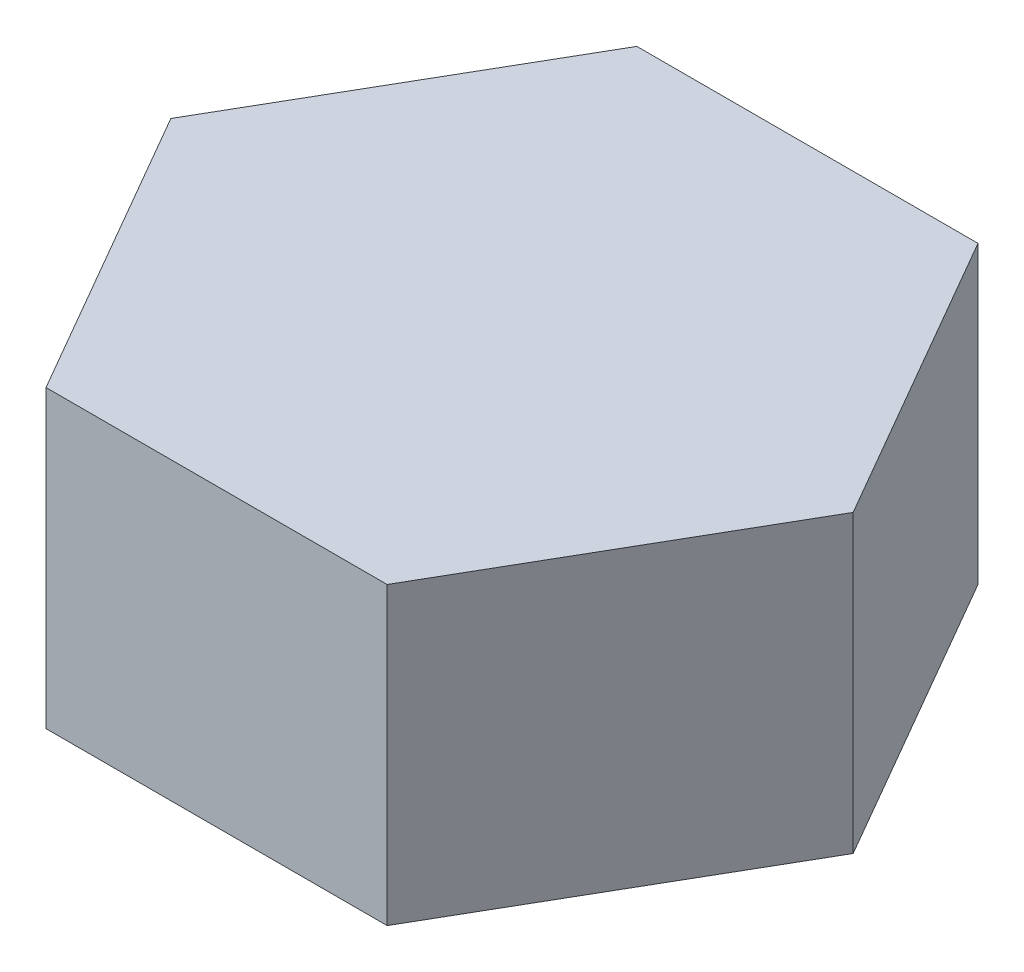
ISO-10303-21;
HEADER;
FILE_DESCRIPTION(('STEP AP214'),'2;1');
FILE_NAME('part.step','',(''),(''),'','','');
FILE_SCHEMA(('AUTOMOTIVE_DESIGN { 1 0 10303 214 1 1 1 1 }'));
ENDSEC;
DATA;
#1=APPLICATION_CONTEXT('core data for automotive mechanical design processes');
#2=APPLICATION_PROTOCOL_DEFINITION('international standard','automotive_design',2000,#1);
#3=PRODUCT_CONTEXT('',#1,'mechanical');
#4=PRODUCT('Part','Part','',(#3));
#5=PRODUCT_RELATED_PRODUCT_CATEGORY('part','',(#4));
#6=PRODUCT_DEFINITION_FORMATION('','',#4);
#7=PRODUCT_DEFINITION_CONTEXT('part definition',#1,'design');
#8=PRODUCT_DEFINITION('design','',#6,#7);
#9=PRODUCT_DEFINITION_SHAPE('','',#8);
#10=(LENGTH_UNIT() NAMED_UNIT(*) SI_UNIT(.MILLI.,.METRE.));
#11=(NAMED_UNIT(*) PLANE_ANGLE_UNIT() SI_UNIT($,.RADIAN.));
#12=(NAMED_UNIT(*) SI_UNIT($,.STERADIAN.) SOLID_ANGLE_UNIT());
#13=UNCERTAINTY_MEASURE_WITH_UNIT(LENGTH_MEASURE(1.E-05),#10,'distance_accuracy_value','');
#14=(GEOMETRIC_REPRESENTATION_CONTEXT(3) GLOBAL_UNCERTAINTY_ASSIGNED_CONTEXT((#13)) GLOBAL_UNIT_ASSIGNED_CONTEXT((#10,
#11,#12)) REPRESENTATION_CONTEXT('',''));
#15=CARTESIAN_POINT('',(0.,0.,0.));
#16=DIRECTION('',(0.,0.,1.));
#17=DIRECTION('',(1.,0.,0.));
#18=AXIS2_PLACEMENT_3D('',#15,#16,#17);
#19=CARTESIAN_POINT('',(115.470053837925,-50.,200.));
#20=DIRECTION('',(0.866025403784439,0.,0.5));
#21=DIRECTION('',(0.5,0.,-0.866025403784439));
#22=AXIS2_PLACEMENT_3D('',#19,#20,#21);
#23=PLANE('',#22);
#24=DIRECTION('',(0.,1.,0.));
#25=VECTOR('',#24,1.);
#26=CARTESIAN_POINT('',(230.94010767585,-50.,-1.11022302462516E-13));
#27=LINE('',#26,#25);
#28=CARTESIAN_POINT('',(230.94010767585,-50.,-1.11022302462516E-13));
#29=VERTEX_POINT('',#28);
#30=CARTESIAN_POINT('',(230.94010767585,150.,-1.11022302462516E-13));
#31=VERTEX_POINT('',#30);
#32=EDGE_CURVE('E38',#29,#31,#27,.T.);
#33=ORIENTED_EDGE('',*,*,#32,.T.);
#34=DIRECTION('',(0.5,0.,-0.866025403784439));
#35=VECTOR('',#34,1.);
#36=CARTESIAN_POINT('',(115.470053837925,150.,200.));
#37=LINE('',#36,#35);
#38=CARTESIAN_POINT('',(115.470053837925,150.,200.));
#39=VERTEX_POINT('',#38);
#40=EDGE_CURVE('E87',#39,#31,#37,.T.);
#41=ORIENTED_EDGE('',*,*,#40,.F.);
#42=DIRECTION('',(0.,1.,0.));
#43=VECTOR('',#42,1.);
#44=CARTESIAN_POINT('',(115.470053837925,-50.,200.));
#45=LINE('',#44,#43);
#46=CARTESIAN_POINT('',(115.470053837925,-50.,200.));
#47=VERTEX_POINT('',#46);
#48=EDGE_CURVE('E11',#47,#39,#45,.T.);
#49=ORIENTED_EDGE('',*,*,#48,.F.);
#50=DIRECTION('',(0.5,0.,-0.866025403784439));
#51=VECTOR('',#50,1.);
#52=CARTESIAN_POINT('',(115.470053837925,-50.,200.));
#53=LINE('',#52,#51);
#54=EDGE_CURVE('E88',#47,#29,#53,.T.);
#55=ORIENTED_EDGE('',*,*,#54,.T.);
#56=EDGE_LOOP('',(#33,#41,#49,#55));
#57=FACE_BOUND('',#56,.T.);
#58=ADVANCED_FACE('F35',(#57),#23,.T.);
#59=CARTESIAN_POINT('',(-115.470053837925,-50.,200.));
#60=DIRECTION('',(0.,0.,1.));
#61=DIRECTION('',(1.,0.,0.));
#62=AXIS2_PLACEMENT_3D('',#59,#60,#61);
#63=PLANE('',#62);
#64=ORIENTED_EDGE('',*,*,#48,.T.);
#65=DIRECTION('',(1.,0.,0.));
#66=VECTOR('',#65,1.);
#67=CARTESIAN_POINT('',(-115.470053837925,150.,200.));
#68=LINE('',#67,#66);
#69=CARTESIAN_POINT('',(-115.470053837925,150.,200.));
#70=VERTEX_POINT('',#69);
#71=EDGE_CURVE('E105',#70,#39,#68,.T.);
#72=ORIENTED_EDGE('',*,*,#71,.F.);
#73=DIRECTION('',(0.,1.,0.));
#74=VECTOR('',#73,1.);
#75=CARTESIAN_POINT('',(-115.470053837925,-50.,200.));
#76=LINE('',#75,#74);
#77=CARTESIAN_POINT('',(-115.470053837925,-50.,200.));
#78=VERTEX_POINT('',#77);
#79=EDGE_CURVE('E43',#78,#70,#76,.T.);
#80=ORIENTED_EDGE('',*,*,#79,.F.);
#81=DIRECTION('',(1.,0.,0.));
#82=VECTOR('',#81,1.);
#83=CARTESIAN_POINT('',(-115.470053837925,-50.,200.));
#84=LINE('',#83,#82);
#85=EDGE_CURVE('E93',#78,#47,#84,.T.);
#86=ORIENTED_EDGE('',*,*,#85,.T.);
#87=EDGE_LOOP('',(#64,#72,#80,#86));
#88=FACE_BOUND('',#87,.T.);
#89=ADVANCED_FACE('F145',(#88),#63,.T.);
#90=CARTESIAN_POINT('',(-230.94010767585,-50.,0.));
#91=DIRECTION('',(-0.866025403784439,0.,0.5));
#92=DIRECTION('',(0.5,0.,0.866025403784439));
#93=AXIS2_PLACEMENT_3D('',#90,#91,#92);
#94=PLANE('',#93);
#95=ORIENTED_EDGE('',*,*,#79,.T.);
#96=DIRECTION('',(0.5,0.,0.866025403784439));
#97=VECTOR('',#96,1.);
#98=CARTESIAN_POINT('',(-230.94010767585,150.,0.));
#99=LINE('',#98,#97);
#100=CARTESIAN_POINT('',(-230.94010767585,150.,0.));
#101=VERTEX_POINT('',#100);
#102=EDGE_CURVE('E112',#101,#70,#99,.T.);
#103=ORIENTED_EDGE('',*,*,#102,.F.);
#104=DIRECTION('',(0.,1.,0.));
#105=VECTOR('',#104,1.);
#106=CARTESIAN_POINT('',(-230.94010767585,-50.,0.));
#107=LINE('',#106,#105);
#108=CARTESIAN_POINT('',(-230.94010767585,-50.,0.));
#109=VERTEX_POINT('',#108);
#110=EDGE_CURVE('E128',#109,#101,#107,.T.);
#111=ORIENTED_EDGE('',*,*,#110,.F.);
#112=DIRECTION('',(0.5,0.,0.866025403784439));
#113=VECTOR('',#112,1.);
#114=CARTESIAN_POINT('',(-230.94010767585,-50.,0.));
#115=LINE('',#114,#113);
#116=EDGE_CURVE('E124',#109,#78,#115,.T.);
#117=ORIENTED_EDGE('',*,*,#116,.T.);
#118=EDGE_LOOP('',(#95,#103,#111,#117));
#119=FACE_BOUND('',#118,.T.);
#120=ADVANCED_FACE('F141',(#119),#94,.T.);
#121=CARTESIAN_POINT('',(-115.470053837925,-50.,-200.));
#122=DIRECTION('',(-0.866025403784439,0.,-0.5));
#123=DIRECTION('',(-0.5,0.,0.866025403784439));
#124=AXIS2_PLACEMENT_3D('',#121,#122,#123);
#125=PLANE('',#124);
#126=ORIENTED_EDGE('',*,*,#110,.T.);
#127=DIRECTION('',(-0.5,0.,0.866025403784439));
#128=VECTOR('',#127,1.);
#129=CARTESIAN_POINT('',(-115.470053837925,150.,-200.));
#130=LINE('',#129,#128);
#131=CARTESIAN_POINT('',(-115.470053837925,150.,-200.));
#132=VERTEX_POINT('',#131);
#133=EDGE_CURVE('E109',#132,#101,#130,.T.);
#134=ORIENTED_EDGE('',*,*,#133,.F.);
#135=DIRECTION('',(0.,1.,0.));
#136=VECTOR('',#135,1.);
#137=CARTESIAN_POINT('',(-115.470053837925,-50.,-200.));
#138=LINE('',#137,#136);
#139=CARTESIAN_POINT('',(-115.470053837925,-50.,-200.));
#140=VERTEX_POINT('',#139);
#141=EDGE_CURVE('E130',#140,#132,#138,.T.);
#142=ORIENTED_EDGE('',*,*,#141,.F.);
#143=DIRECTION('',(-0.5,0.,0.866025403784439));
#144=VECTOR('',#143,1.);
#145=CARTESIAN_POINT('',(-115.470053837925,-50.,-200.));
#146=LINE('',#145,#144);
#147=EDGE_CURVE('E121',#140,#109,#146,.T.);
#148=ORIENTED_EDGE('',*,*,#147,.T.);
#149=EDGE_LOOP('',(#126,#134,#142,#148));
#150=FACE_BOUND('',#149,.T.);
#151=ADVANCED_FACE('F138',(#150),#125,.T.);
#152=CARTESIAN_POINT('',(115.470053837925,-50.,-200.));
#153=DIRECTION('',(0.,0.,-1.));
#154=DIRECTION('',(-1.,0.,0.));
#155=AXIS2_PLACEMENT_3D('',#152,#153,#154);
#156=PLANE('',#155);
#157=ORIENTED_EDGE('',*,*,#141,.T.);
#158=DIRECTION('',(-1.,0.,0.));
#159=VECTOR('',#158,1.);
#160=CARTESIAN_POINT('',(115.470053837925,150.,-200.));
#161=LINE('',#160,#159);
#162=CARTESIAN_POINT('',(115.470053837925,150.,-200.));
#163=VERTEX_POINT('',#162);
#164=EDGE_CURVE('E100',#163,#132,#161,.T.);
#165=ORIENTED_EDGE('',*,*,#164,.F.);
#166=DIRECTION('',(0.,1.,0.));
#167=VECTOR('',#166,1.);
#168=CARTESIAN_POINT('',(115.470053837925,-50.,-200.));
#169=LINE('',#168,#167);
#170=CARTESIAN_POINT('',(115.470053837925,-50.,-200.));
#171=VERTEX_POINT('',#170);
#172=EDGE_CURVE('E92',#171,#163,#169,.T.);
#173=ORIENTED_EDGE('',*,*,#172,.F.);
#174=DIRECTION('',(-1.,0.,0.));
#175=VECTOR('',#174,1.);
#176=CARTESIAN_POINT('',(115.470053837925,-50.,-200.));
#177=LINE('',#176,#175);
#178=EDGE_CURVE('E118',#171,#140,#177,.T.);
#179=ORIENTED_EDGE('',*,*,#178,.T.);
#180=EDGE_LOOP('',(#157,#165,#173,#179));
#181=FACE_BOUND('',#180,.T.);
#182=ADVANCED_FACE('F132',(#181),#156,.T.);
#183=CARTESIAN_POINT('',(230.94010767585,-50.,-1.11022302462516E-13));
#184=DIRECTION('',(0.866025403784439,0.,-0.5));
#185=DIRECTION('',(-0.5,0.,-0.866025403784439));
#186=AXIS2_PLACEMENT_3D('',#183,#184,#185);
#187=PLANE('',#186);
#188=ORIENTED_EDGE('',*,*,#172,.T.);
#189=DIRECTION('',(-0.5,0.,-0.866025403784439));
#190=VECTOR('',#189,1.);
#191=CARTESIAN_POINT('',(230.94010767585,150.,-1.11022302462516E-13));
#192=LINE('',#191,#190);
#193=EDGE_CURVE('E95',#31,#163,#192,.T.);
#194=ORIENTED_EDGE('',*,*,#193,.F.);
#195=ORIENTED_EDGE('',*,*,#32,.F.);
#196=DIRECTION('',(-0.5,0.,-0.866025403784439));
#197=VECTOR('',#196,1.);
#198=CARTESIAN_POINT('',(230.94010767585,-50.,-1.11022302462516E-13));
#199=LINE('',#198,#197);
#200=EDGE_CURVE('E116',#29,#171,#199,.T.);
#201=ORIENTED_EDGE('',*,*,#200,.T.);
#202=EDGE_LOOP('',(#188,#194,#195,#201));
#203=FACE_BOUND('',#202,.T.);
#204=ADVANCED_FACE('F96',(#203),#187,.T.);
#205=CARTESIAN_POINT('',(0.,-50.,0.));
#206=DIRECTION('',(0.,1.,0.));
#207=DIRECTION('',(0.,0.,1.));
#208=AXIS2_PLACEMENT_3D('',#205,#206,#207);
#209=PLANE('',#208);
#210=ORIENTED_EDGE('',*,*,#54,.F.);
#211=ORIENTED_EDGE('',*,*,#85,.F.);
#212=ORIENTED_EDGE('',*,*,#116,.F.);
#213=ORIENTED_EDGE('',*,*,#147,.F.);
#214=ORIENTED_EDGE('',*,*,#178,.F.);
#215=ORIENTED_EDGE('',*,*,#200,.F.);
#216=EDGE_LOOP('',(#210,#211,#212,#213,#214,#215));
#217=FACE_BOUND('',#216,.T.);
#218=ADVANCED_FACE('F144',(#217),#209,.F.);
#219=CARTESIAN_POINT('',(0.,150.,0.));
#220=DIRECTION('',(0.,1.,0.));
#221=DIRECTION('',(0.,0.,1.));
#222=AXIS2_PLACEMENT_3D('',#219,#220,#221);
#223=PLANE('',#222);
#224=ORIENTED_EDGE('',*,*,#40,.T.);
#225=ORIENTED_EDGE('',*,*,#193,.T.);
#226=ORIENTED_EDGE('',*,*,#164,.T.);
#227=ORIENTED_EDGE('',*,*,#133,.T.);
#228=ORIENTED_EDGE('',*,*,#102,.T.);
#229=ORIENTED_EDGE('',*,*,#71,.T.);
#230=EDGE_LOOP('',(#224,#225,#226,#227,#228,#229));
#231=FACE_BOUND('',#230,.T.);
#232=ADVANCED_FACE('F103',(#231),#223,.T.);
#233=CLOSED_SHELL('',(#58,#89,#120,#151,#182,#204,#218,#232));
#234=MANIFOLD_SOLID_BREP('B2',#233);
#235=ADVANCED_BREP_SHAPE_REPRESENTATION('',(#18,#234),#14);
#236=SHAPE_DEFINITION_REPRESENTATION(#9,#235);
ENDSEC;
END-ISO-10303-21;
